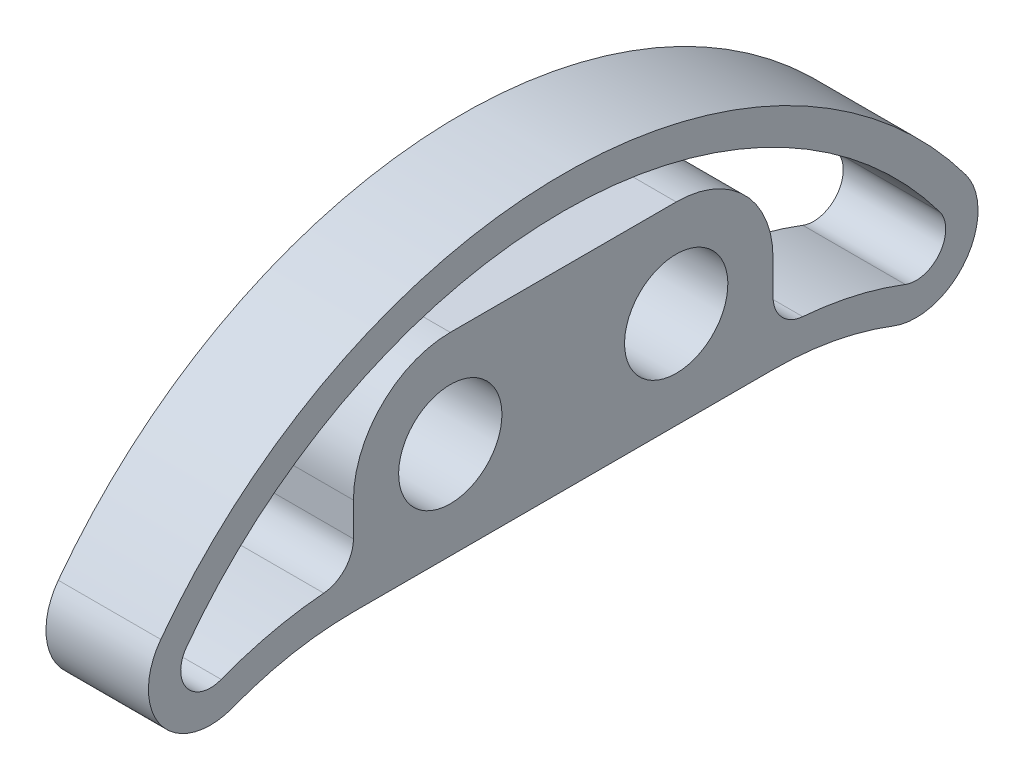
ISO-10303-21;
HEADER;
FILE_DESCRIPTION(('STEP AP214'),'2;1');
FILE_NAME('part.step','',(''),(''),'','','');
FILE_SCHEMA(('AUTOMOTIVE_DESIGN { 1 0 10303 214 1 1 1 1 }'));
ENDSEC;
DATA;
#1=APPLICATION_CONTEXT('core data for automotive mechanical design processes');
#2=APPLICATION_PROTOCOL_DEFINITION('international standard','automotive_design',2000,#1);
#3=PRODUCT_CONTEXT('',#1,'mechanical');
#4=PRODUCT('Part','Part','',(#3));
#5=PRODUCT_RELATED_PRODUCT_CATEGORY('part','',(#4));
#6=PRODUCT_DEFINITION_FORMATION('','',#4);
#7=PRODUCT_DEFINITION_CONTEXT('part definition',#1,'design');
#8=PRODUCT_DEFINITION('design','',#6,#7);
#9=PRODUCT_DEFINITION_SHAPE('','',#8);
#10=(LENGTH_UNIT() NAMED_UNIT(*) SI_UNIT(.MILLI.,.METRE.));
#11=(NAMED_UNIT(*) PLANE_ANGLE_UNIT() SI_UNIT($,.RADIAN.));
#12=(NAMED_UNIT(*) SI_UNIT($,.STERADIAN.) SOLID_ANGLE_UNIT());
#13=UNCERTAINTY_MEASURE_WITH_UNIT(LENGTH_MEASURE(1.E-05),#10,'distance_accuracy_value','');
#14=(GEOMETRIC_REPRESENTATION_CONTEXT(3) GLOBAL_UNCERTAINTY_ASSIGNED_CONTEXT((#13)) GLOBAL_UNIT_ASSIGNED_CONTEXT((#10,
#11,#12)) REPRESENTATION_CONTEXT('',''));
#15=CARTESIAN_POINT('',(0.,0.,0.));
#16=DIRECTION('',(0.,0.,1.));
#17=DIRECTION('',(1.,0.,0.));
#18=AXIS2_PLACEMENT_3D('',#15,#16,#17);
#19=CARTESIAN_POINT('',(27.975,26.9595465994208,25.));
#20=DIRECTION('',(-1.,0.,0.));
#21=DIRECTION('',(0.,-1.,0.));
#22=AXIS2_PLACEMENT_3D('',#19,#20,#21);
#23=CYLINDRICAL_SURFACE('',#22,1.);
#24=DIRECTION('',(1.,0.,0.));
#25=VECTOR('',#24,1.);
#26=CARTESIAN_POINT('',(27.975,26.9595465994208,24.));
#27=LINE('',#26,#25);
#28=CARTESIAN_POINT('',(24.8,26.9595465994208,24.));
#29=VERTEX_POINT('',#28);
#30=CARTESIAN_POINT('',(27.975,26.9595465994208,24.));
#31=VERTEX_POINT('',#30);
#32=EDGE_CURVE('E223',#29,#31,#27,.T.);
#33=ORIENTED_EDGE('',*,*,#32,.F.);
#34=CARTESIAN_POINT('',(24.8,26.9595465994208,25.));
#35=DIRECTION('',(-1.,0.,0.));
#36=DIRECTION('',(0.,-1.,0.));
#37=AXIS2_PLACEMENT_3D('',#34,#35,#36);
#38=CIRCLE('',#37,1.);
#39=CARTESIAN_POINT('',(24.8,25.9628142072905,24.9192253846918));
#40=VERTEX_POINT('',#39);
#41=EDGE_CURVE('E208',#40,#29,#38,.F.);
#42=ORIENTED_EDGE('',*,*,#41,.F.);
#43=DIRECTION('',(-1.,0.,0.));
#44=VECTOR('',#43,1.);
#45=CARTESIAN_POINT('',(27.975,25.9628142072905,24.9192253846918));
#46=LINE('',#45,#44);
#47=CARTESIAN_POINT('',(27.975,25.9628142072905,24.9192253846918));
#48=VERTEX_POINT('',#47);
#49=EDGE_CURVE('E297',#48,#40,#46,.T.);
#50=ORIENTED_EDGE('',*,*,#49,.F.);
#51=CARTESIAN_POINT('',(27.975,26.9595465994208,25.));
#52=DIRECTION('',(-1.,0.,0.));
#53=DIRECTION('',(0.,-1.,0.));
#54=AXIS2_PLACEMENT_3D('',#51,#52,#53);
#55=CIRCLE('',#54,1.);
#56=EDGE_CURVE('E19',#31,#48,#55,.T.);
#57=ORIENTED_EDGE('',*,*,#56,.F.);
#58=EDGE_LOOP('',(#33,#42,#50,#57));
#59=FACE_BOUND('',#58,.T.);
#60=ADVANCED_FACE('F16',(#59),#23,.F.);
#61=CARTESIAN_POINT('',(27.975,26.,24.));
#62=DIRECTION('',(0.,0.,1.));
#63=DIRECTION('',(0.,-1.,0.));
#64=AXIS2_PLACEMENT_3D('',#61,#62,#63);
#65=PLANE('',#64);
#66=DIRECTION('',(0.,-1.,0.));
#67=VECTOR('',#66,1.);
#68=CARTESIAN_POINT('',(27.975,26.,24.));
#69=LINE('',#68,#67);
#70=CARTESIAN_POINT('',(27.975,28.,24.));
#71=VERTEX_POINT('',#70);
#72=EDGE_CURVE('E215',#31,#71,#69,.F.);
#73=ORIENTED_EDGE('',*,*,#72,.T.);
#74=DIRECTION('',(-1.,0.,0.));
#75=VECTOR('',#74,1.);
#76=CARTESIAN_POINT('',(27.975,28.,24.));
#77=LINE('',#76,#75);
#78=CARTESIAN_POINT('',(24.8,28.,24.));
#79=VERTEX_POINT('',#78);
#80=EDGE_CURVE('E220',#79,#71,#77,.F.);
#81=ORIENTED_EDGE('',*,*,#80,.F.);
#82=DIRECTION('',(0.,-1.,0.));
#83=VECTOR('',#82,1.);
#84=CARTESIAN_POINT('',(24.8,14.6198729491416,24.));
#85=LINE('',#84,#83);
#86=EDGE_CURVE('E204',#29,#79,#85,.F.);
#87=ORIENTED_EDGE('',*,*,#86,.F.);
#88=ORIENTED_EDGE('',*,*,#32,.T.);
#89=EDGE_LOOP('',(#73,#81,#87,#88));
#90=FACE_BOUND('',#89,.T.);
#91=ADVANCED_FACE('F347',(#90),#65,.T.);
#92=CARTESIAN_POINT('',(27.975,26.,11.));
#93=DIRECTION('',(0.,0.,-1.));
#94=DIRECTION('',(-1.,0.,0.));
#95=AXIS2_PLACEMENT_3D('',#92,#93,#94);
#96=PLANE('',#95);
#97=DIRECTION('',(0.,-1.,0.));
#98=VECTOR('',#97,1.);
#99=CARTESIAN_POINT('',(24.8,14.6198729491416,11.));
#100=LINE('',#99,#98);
#101=CARTESIAN_POINT('',(24.8,28.,11.));
#102=VERTEX_POINT('',#101);
#103=CARTESIAN_POINT('',(24.8,26.9595465994209,11.));
#104=VERTEX_POINT('',#103);
#105=EDGE_CURVE('E209',#102,#104,#100,.T.);
#106=ORIENTED_EDGE('',*,*,#105,.F.);
#107=DIRECTION('',(-1.,0.,0.));
#108=VECTOR('',#107,1.);
#109=CARTESIAN_POINT('',(27.975,28.,11.));
#110=LINE('',#109,#108);
#111=CARTESIAN_POINT('',(27.975,28.,11.));
#112=VERTEX_POINT('',#111);
#113=EDGE_CURVE('E283',#112,#102,#110,.T.);
#114=ORIENTED_EDGE('',*,*,#113,.F.);
#115=DIRECTION('',(0.,1.,0.));
#116=VECTOR('',#115,1.);
#117=CARTESIAN_POINT('',(27.975,26.,11.));
#118=LINE('',#117,#116);
#119=CARTESIAN_POINT('',(27.975,26.9595465994209,11.));
#120=VERTEX_POINT('',#119);
#121=EDGE_CURVE('E212',#112,#120,#118,.F.);
#122=ORIENTED_EDGE('',*,*,#121,.T.);
#123=DIRECTION('',(-1.,0.,0.));
#124=VECTOR('',#123,1.);
#125=CARTESIAN_POINT('',(27.975,26.9595465994209,11.));
#126=LINE('',#125,#124);
#127=EDGE_CURVE('E207',#120,#104,#126,.T.);
#128=ORIENTED_EDGE('',*,*,#127,.T.);
#129=EDGE_LOOP('',(#106,#114,#122,#128));
#130=FACE_BOUND('',#129,.T.);
#131=ADVANCED_FACE('F451',(#130),#96,.T.);
#132=CARTESIAN_POINT('',(24.8,14.6198729491416,11.));
#133=DIRECTION('',(-1.,0.,0.));
#134=DIRECTION('',(0.,-1.,0.));
#135=AXIS2_PLACEMENT_3D('',#132,#133,#134);
#136=PLANE('',#135);
#137=DIRECTION('',(0.,0.,1.));
#138=VECTOR('',#137,1.);
#139=CARTESIAN_POINT('',(24.8,31.,14.));
#140=LINE('',#139,#138);
#141=CARTESIAN_POINT('',(24.8,31.,14.));
#142=VERTEX_POINT('',#141);
#143=CARTESIAN_POINT('',(24.8,31.,21.));
#144=VERTEX_POINT('',#143);
#145=EDGE_CURVE('E216',#142,#144,#140,.T.);
#146=ORIENTED_EDGE('',*,*,#145,.F.);
#147=CARTESIAN_POINT('',(24.8,28.,14.));
#148=DIRECTION('',(-1.,0.,0.));
#149=DIRECTION('',(0.,-1.,0.));
#150=AXIS2_PLACEMENT_3D('',#147,#148,#149);
#151=CIRCLE('',#150,3.);
#152=EDGE_CURVE('E284',#102,#142,#151,.F.);
#153=ORIENTED_EDGE('',*,*,#152,.F.);
#154=ORIENTED_EDGE('',*,*,#105,.T.);
#155=CARTESIAN_POINT('',(24.8,26.9595465994209,10.));
#156=DIRECTION('',(-1.,0.,0.));
#157=DIRECTION('',(0.,-1.,0.));
#158=AXIS2_PLACEMENT_3D('',#155,#156,#157);
#159=CIRCLE('',#158,1.);
#160=CARTESIAN_POINT('',(24.8,25.9628142072905,10.0807746153082));
#161=VERTEX_POINT('',#160);
#162=EDGE_CURVE('E228',#104,#161,#159,.F.);
#163=ORIENTED_EDGE('',*,*,#162,.T.);
#164=CARTESIAN_POINT('',(24.8,14.6198729491416,11.));
#165=DIRECTION('',(-1.,0.,0.));
#166=DIRECTION('',(0.,-1.,0.));
#167=AXIS2_PLACEMENT_3D('',#164,#165,#166);
#168=CIRCLE('',#167,11.3801270508584);
#169=CARTESIAN_POINT('',(24.8,25.2368989387214,6.90292167145082));
#170=VERTEX_POINT('',#169);
#171=EDGE_CURVE('E279',#170,#161,#168,.F.);
#172=ORIENTED_EDGE('',*,*,#171,.F.);
#173=CARTESIAN_POINT('',(24.8,26.0969650195722,6.57102476317985));
#174=DIRECTION('',(-1.,0.,0.));
#175=DIRECTION('',(0.,-1.,0.));
#176=AXIS2_PLACEMENT_3D('',#173,#174,#175);
#177=CIRCLE('',#176,0.921883518211437);
#178=CARTESIAN_POINT('',(24.8,26.6482953762254,5.83217155787958));
#179=VERTEX_POINT('',#178);
#180=EDGE_CURVE('E306',#170,#179,#177,.F.);
#181=ORIENTED_EDGE('',*,*,#180,.T.);
#182=CARTESIAN_POINT('',(24.8,17.9417918783504,17.5));
#183=DIRECTION('',(-1.,0.,0.));
#184=DIRECTION('',(0.,-1.,0.));
#185=AXIS2_PLACEMENT_3D('',#182,#183,#184);
#186=CIRCLE('',#185,14.5582081216496);
#187=CARTESIAN_POINT('',(24.8,26.6482953762254,29.1678284421204));
#188=VERTEX_POINT('',#187);
#189=EDGE_CURVE('E302',#179,#188,#186,.F.);
#190=ORIENTED_EDGE('',*,*,#189,.T.);
#191=CARTESIAN_POINT('',(24.8,26.0969650195722,28.4289752368201));
#192=DIRECTION('',(-1.,0.,0.));
#193=DIRECTION('',(0.,-1.,0.));
#194=AXIS2_PLACEMENT_3D('',#191,#192,#193);
#195=CIRCLE('',#194,0.921883518211437);
#196=CARTESIAN_POINT('',(24.8,25.2368989387213,28.0970783285492));
#197=VERTEX_POINT('',#196);
#198=EDGE_CURVE('E298',#188,#197,#195,.F.);
#199=ORIENTED_EDGE('',*,*,#198,.T.);
#200=CARTESIAN_POINT('',(24.8,14.6198729491416,24.));
#201=DIRECTION('',(-1.,0.,0.));
#202=DIRECTION('',(0.,-1.,0.));
#203=AXIS2_PLACEMENT_3D('',#200,#201,#202);
#204=CIRCLE('',#203,11.3801270508584);
#205=EDGE_CURVE('E293',#40,#197,#204,.F.);
#206=ORIENTED_EDGE('',*,*,#205,.F.);
#207=ORIENTED_EDGE('',*,*,#41,.T.);
#208=ORIENTED_EDGE('',*,*,#86,.T.);
#209=CARTESIAN_POINT('',(24.8,28.,21.));
#210=DIRECTION('',(-1.,0.,0.));
#211=DIRECTION('',(0.,-1.,0.));
#212=AXIS2_PLACEMENT_3D('',#209,#210,#211);
#213=CIRCLE('',#212,3.);
#214=EDGE_CURVE('E288',#144,#79,#213,.F.);
#215=ORIENTED_EDGE('',*,*,#214,.F.);
#216=EDGE_LOOP('',(#146,#153,#154,#163,#172,#181,#190,#199,#206,#207,#208,#215));
#217=FACE_BOUND('',#216,.T.);
#218=CARTESIAN_POINT('',(24.8,28.,14.));
#219=DIRECTION('',(-1.,0.,0.));
#220=DIRECTION('',(0.,-1.,0.));
#221=AXIS2_PLACEMENT_3D('',#218,#219,#220);
#222=CIRCLE('',#221,1.6);
#223=CARTESIAN_POINT('',(24.8,26.4,14.));
#224=VERTEX_POINT('',#223);
#225=EDGE_CURVE('E323',#224,#224,#222,.F.);
#226=ORIENTED_EDGE('',*,*,#225,.T.);
#227=EDGE_LOOP('',(#226));
#228=FACE_BOUND('',#227,.T.);
#229=CARTESIAN_POINT('',(24.8,26.0969650195722,6.57102476317985));
#230=DIRECTION('',(-1.,0.,0.));
#231=DIRECTION('',(0.,-1.,0.));
#232=AXIS2_PLACEMENT_3D('',#229,#230,#231);
#233=CIRCLE('',#232,1.92188351821144);
#234=CARTESIAN_POINT('',(24.8,24.3039545223601,7.26294210973232));
#235=VERTEX_POINT('',#234);
#236=CARTESIAN_POINT('',(24.8,27.2463431184422,5.03071107973397));
#237=VERTEX_POINT('',#236);
#238=EDGE_CURVE('E312',#235,#237,#233,.F.);
#239=ORIENTED_EDGE('',*,*,#238,.F.);
#240=CARTESIAN_POINT('',(24.8,14.6198729491416,11.));
#241=DIRECTION('',(-1.,0.,0.));
#242=DIRECTION('',(0.,-1.,0.));
#243=AXIS2_PLACEMENT_3D('',#240,#241,#242);
#244=CIRCLE('',#243,10.3801270508584);
#245=CARTESIAN_POINT('',(24.8,25.,11.));
#246=VERTEX_POINT('',#245);
#247=EDGE_CURVE('E174',#235,#246,#244,.F.);
#248=ORIENTED_EDGE('',*,*,#247,.T.);
#249=DIRECTION('',(0.,0.,1.));
#250=VECTOR('',#249,1.);
#251=CARTESIAN_POINT('',(24.8,25.,24.));
#252=LINE('',#251,#250);
#253=CARTESIAN_POINT('',(24.8,25.,24.));
#254=VERTEX_POINT('',#253);
#255=EDGE_CURVE('E168',#246,#254,#252,.T.);
#256=ORIENTED_EDGE('',*,*,#255,.T.);
#257=CARTESIAN_POINT('',(24.8,14.6198729491416,24.));
#258=DIRECTION('',(-1.,0.,0.));
#259=DIRECTION('',(0.,-1.,0.));
#260=AXIS2_PLACEMENT_3D('',#257,#258,#259);
#261=CIRCLE('',#260,10.3801270508584);
#262=CARTESIAN_POINT('',(24.8,24.3039545223601,27.7370578902677));
#263=VERTEX_POINT('',#262);
#264=EDGE_CURVE('E172',#254,#263,#261,.F.);
#265=ORIENTED_EDGE('',*,*,#264,.T.);
#266=CARTESIAN_POINT('',(24.8,26.0969650195722,28.4289752368201));
#267=DIRECTION('',(-1.,0.,0.));
#268=DIRECTION('',(0.,-1.,0.));
#269=AXIS2_PLACEMENT_3D('',#266,#267,#268);
#270=CIRCLE('',#269,1.92188351821144);
#271=CARTESIAN_POINT('',(24.8,27.2463431184422,29.969288920266));
#272=VERTEX_POINT('',#271);
#273=EDGE_CURVE('E191',#272,#263,#270,.F.);
#274=ORIENTED_EDGE('',*,*,#273,.F.);
#275=CARTESIAN_POINT('',(24.8,17.9417918783504,17.5));
#276=DIRECTION('',(-1.,0.,0.));
#277=DIRECTION('',(0.,-1.,0.));
#278=AXIS2_PLACEMENT_3D('',#275,#276,#277);
#279=CIRCLE('',#278,15.5582081216496);
#280=EDGE_CURVE('E161',#237,#272,#279,.F.);
#281=ORIENTED_EDGE('',*,*,#280,.F.);
#282=EDGE_LOOP('',(#239,#248,#256,#265,#274,#281));
#283=FACE_BOUND('',#282,.T.);
#284=CARTESIAN_POINT('',(24.8,28.,21.));
#285=DIRECTION('',(-1.,0.,0.));
#286=DIRECTION('',(0.,-1.,0.));
#287=AXIS2_PLACEMENT_3D('',#284,#285,#286);
#288=CIRCLE('',#287,1.6);
#289=CARTESIAN_POINT('',(24.8,26.4,21.));
#290=VERTEX_POINT('',#289);
#291=EDGE_CURVE('E181',#290,#290,#288,.F.);
#292=ORIENTED_EDGE('',*,*,#291,.T.);
#293=EDGE_LOOP('',(#292));
#294=FACE_BOUND('',#293,.T.);
#295=ADVANCED_FACE('F170',(#217,#228,#283,#294),#136,.T.);
#296=CARTESIAN_POINT('',(27.975,26.9595465994209,10.));
#297=DIRECTION('',(-1.,0.,0.));
#298=DIRECTION('',(0.,-1.,0.));
#299=AXIS2_PLACEMENT_3D('',#296,#297,#298);
#300=CYLINDRICAL_SURFACE('',#299,1.);
#301=DIRECTION('',(-1.,0.,0.));
#302=VECTOR('',#301,1.);
#303=CARTESIAN_POINT('',(27.975,25.9628142072905,10.0807746153082));
#304=LINE('',#303,#302);
#305=CARTESIAN_POINT('',(27.975,25.9628142072905,10.0807746153082));
#306=VERTEX_POINT('',#305);
#307=EDGE_CURVE('E282',#161,#306,#304,.F.);
#308=ORIENTED_EDGE('',*,*,#307,.F.);
#309=ORIENTED_EDGE('',*,*,#162,.F.);
#310=ORIENTED_EDGE('',*,*,#127,.F.);
#311=CARTESIAN_POINT('',(27.975,26.9595465994209,10.));
#312=DIRECTION('',(-1.,0.,0.));
#313=DIRECTION('',(0.,-1.,0.));
#314=AXIS2_PLACEMENT_3D('',#311,#312,#313);
#315=CIRCLE('',#314,1.);
#316=EDGE_CURVE('E327',#306,#120,#315,.T.);
#317=ORIENTED_EDGE('',*,*,#316,.F.);
#318=EDGE_LOOP('',(#308,#309,#310,#317));
#319=FACE_BOUND('',#318,.T.);
#320=ADVANCED_FACE('F448',(#319),#300,.F.);
#321=CARTESIAN_POINT('',(27.975,28.,14.));
#322=DIRECTION('',(-1.,0.,0.));
#323=DIRECTION('',(0.,-1.,0.));
#324=AXIS2_PLACEMENT_3D('',#321,#322,#323);
#325=CYLINDRICAL_SURFACE('',#324,1.6);
#326=ORIENTED_EDGE('',*,*,#225,.F.);
#327=EDGE_LOOP('',(#326));
#328=FACE_BOUND('',#327,.T.);
#329=CARTESIAN_POINT('',(27.975,28.,14.));
#330=DIRECTION('',(-1.,0.,0.));
#331=DIRECTION('',(0.,-1.,0.));
#332=AXIS2_PLACEMENT_3D('',#329,#330,#331);
#333=CIRCLE('',#332,1.6);
#334=CARTESIAN_POINT('',(27.975,26.4,14.));
#335=VERTEX_POINT('',#334);
#336=EDGE_CURVE('E274',#335,#335,#333,.F.);
#337=ORIENTED_EDGE('',*,*,#336,.T.);
#338=EDGE_LOOP('',(#337));
#339=FACE_BOUND('',#338,.T.);
#340=ADVANCED_FACE('F501',(#328,#339),#325,.F.);
#341=CARTESIAN_POINT('',(27.975,28.,21.));
#342=DIRECTION('',(-1.,0.,0.));
#343=DIRECTION('',(0.,-1.,0.));
#344=AXIS2_PLACEMENT_3D('',#341,#342,#343);
#345=CYLINDRICAL_SURFACE('',#344,1.6);
#346=ORIENTED_EDGE('',*,*,#291,.F.);
#347=EDGE_LOOP('',(#346));
#348=FACE_BOUND('',#347,.T.);
#349=CARTESIAN_POINT('',(27.975,28.,21.));
#350=DIRECTION('',(-1.,0.,0.));
#351=DIRECTION('',(0.,-1.,0.));
#352=AXIS2_PLACEMENT_3D('',#349,#350,#351);
#353=CIRCLE('',#352,1.6);
#354=CARTESIAN_POINT('',(27.975,26.4,21.));
#355=VERTEX_POINT('',#354);
#356=EDGE_CURVE('E270',#355,#355,#353,.F.);
#357=ORIENTED_EDGE('',*,*,#356,.T.);
#358=EDGE_LOOP('',(#357));
#359=FACE_BOUND('',#358,.T.);
#360=ADVANCED_FACE('F504',(#348,#359),#345,.F.);
#361=CARTESIAN_POINT('',(27.975,25.,24.));
#362=DIRECTION('',(0.,1.,0.));
#363=DIRECTION('',(-1.,0.,0.));
#364=AXIS2_PLACEMENT_3D('',#361,#362,#363);
#365=PLANE('',#364);
#366=DIRECTION('',(-1.,0.,0.));
#367=VECTOR('',#366,1.);
#368=CARTESIAN_POINT('',(27.975,25.,11.));
#369=LINE('',#368,#367);
#370=CARTESIAN_POINT('',(27.975,25.,11.));
#371=VERTEX_POINT('',#370);
#372=EDGE_CURVE('E367',#246,#371,#369,.F.);
#373=ORIENTED_EDGE('',*,*,#372,.T.);
#374=DIRECTION('',(0.,0.,1.));
#375=VECTOR('',#374,1.);
#376=CARTESIAN_POINT('',(27.975,25.,11.));
#377=LINE('',#376,#375);
#378=CARTESIAN_POINT('',(27.975,25.,24.));
#379=VERTEX_POINT('',#378);
#380=EDGE_CURVE('E196',#371,#379,#377,.T.);
#381=ORIENTED_EDGE('',*,*,#380,.T.);
#382=DIRECTION('',(-1.,0.,0.));
#383=VECTOR('',#382,1.);
#384=CARTESIAN_POINT('',(27.975,25.,24.));
#385=LINE('',#384,#383);
#386=EDGE_CURVE('E187',#379,#254,#385,.T.);
#387=ORIENTED_EDGE('',*,*,#386,.T.);
#388=ORIENTED_EDGE('',*,*,#255,.F.);
#389=EDGE_LOOP('',(#373,#381,#387,#388));
#390=FACE_BOUND('',#389,.T.);
#391=ADVANCED_FACE('F194',(#390),#365,.F.);
#392=CARTESIAN_POINT('',(27.975,14.6198729491416,24.));
#393=DIRECTION('',(-1.,0.,0.));
#394=DIRECTION('',(0.,-1.,0.));
#395=AXIS2_PLACEMENT_3D('',#392,#393,#394);
#396=CYLINDRICAL_SURFACE('',#395,10.3801270508584);
#397=ORIENTED_EDGE('',*,*,#386,.F.);
#398=CARTESIAN_POINT('',(27.975,14.6198729491416,24.));
#399=DIRECTION('',(-1.,0.,0.));
#400=DIRECTION('',(0.,-1.,0.));
#401=AXIS2_PLACEMENT_3D('',#398,#399,#400);
#402=CIRCLE('',#401,10.3801270508584);
#403=CARTESIAN_POINT('',(27.975,24.3039545223601,27.7370578902677));
#404=VERTEX_POINT('',#403);
#405=EDGE_CURVE('E267',#379,#404,#402,.F.);
#406=ORIENTED_EDGE('',*,*,#405,.T.);
#407=DIRECTION('',(-1.,0.,0.));
#408=VECTOR('',#407,1.);
#409=CARTESIAN_POINT('',(27.975,24.3039545223601,27.7370578902677));
#410=LINE('',#409,#408);
#411=EDGE_CURVE('E180',#263,#404,#410,.F.);
#412=ORIENTED_EDGE('',*,*,#411,.F.);
#413=ORIENTED_EDGE('',*,*,#264,.F.);
#414=EDGE_LOOP('',(#397,#406,#412,#413));
#415=FACE_BOUND('',#414,.T.);
#416=ADVANCED_FACE('F185',(#415),#396,.F.);
#417=CARTESIAN_POINT('',(27.975,26.0969650195722,28.4289752368201));
#418=DIRECTION('',(-1.,0.,0.));
#419=DIRECTION('',(0.,-1.,0.));
#420=AXIS2_PLACEMENT_3D('',#417,#418,#419);
#421=CYLINDRICAL_SURFACE('',#420,1.92188351821144);
#422=DIRECTION('',(-1.,0.,0.));
#423=VECTOR('',#422,1.);
#424=CARTESIAN_POINT('',(27.975,27.2463431184422,29.969288920266));
#425=LINE('',#424,#423);
#426=CARTESIAN_POINT('',(27.975,27.2463431184422,29.969288920266));
#427=VERTEX_POINT('',#426);
#428=EDGE_CURVE('E315',#272,#427,#425,.F.);
#429=ORIENTED_EDGE('',*,*,#428,.F.);
#430=ORIENTED_EDGE('',*,*,#273,.T.);
#431=ORIENTED_EDGE('',*,*,#411,.T.);
#432=CARTESIAN_POINT('',(27.975,26.0969650195722,28.4289752368201));
#433=DIRECTION('',(-1.,0.,0.));
#434=DIRECTION('',(0.,-1.,0.));
#435=AXIS2_PLACEMENT_3D('',#432,#433,#434);
#436=CIRCLE('',#435,1.92188351821144);
#437=EDGE_CURVE('E263',#404,#427,#436,.T.);
#438=ORIENTED_EDGE('',*,*,#437,.T.);
#439=EDGE_LOOP('',(#429,#430,#431,#438));
#440=FACE_BOUND('',#439,.T.);
#441=ADVANCED_FACE('F383',(#440),#421,.T.);
#442=CARTESIAN_POINT('',(27.975,17.9417918783504,17.5));
#443=DIRECTION('',(-1.,0.,0.));
#444=DIRECTION('',(0.,-1.,0.));
#445=AXIS2_PLACEMENT_3D('',#442,#443,#444);
#446=CYLINDRICAL_SURFACE('',#445,15.5582081216496);
#447=CARTESIAN_POINT('',(27.975,17.9417918783504,17.5));
#448=DIRECTION('',(-1.,0.,0.));
#449=DIRECTION('',(0.,-1.,0.));
#450=AXIS2_PLACEMENT_3D('',#447,#448,#449);
#451=CIRCLE('',#450,15.5582081216496);
#452=CARTESIAN_POINT('',(27.975,27.2463431184422,5.03071107973397));
#453=VERTEX_POINT('',#452);
#454=EDGE_CURVE('E259',#427,#453,#451,.T.);
#455=ORIENTED_EDGE('',*,*,#454,.T.);
#456=DIRECTION('',(-1.,0.,0.));
#457=VECTOR('',#456,1.);
#458=CARTESIAN_POINT('',(27.975,27.2463431184422,5.03071107973397));
#459=LINE('',#458,#457);
#460=EDGE_CURVE('E122',#237,#453,#459,.F.);
#461=ORIENTED_EDGE('',*,*,#460,.F.);
#462=ORIENTED_EDGE('',*,*,#280,.T.);
#463=ORIENTED_EDGE('',*,*,#428,.T.);
#464=EDGE_LOOP('',(#455,#461,#462,#463));
#465=FACE_BOUND('',#464,.T.);
#466=ADVANCED_FACE('F376',(#465),#446,.T.);
#467=CARTESIAN_POINT('',(27.975,26.0969650195722,6.57102476317985));
#468=DIRECTION('',(-1.,0.,0.));
#469=DIRECTION('',(0.,-1.,0.));
#470=AXIS2_PLACEMENT_3D('',#467,#468,#469);
#471=CYLINDRICAL_SURFACE('',#470,1.92188351821144);
#472=ORIENTED_EDGE('',*,*,#238,.T.);
#473=ORIENTED_EDGE('',*,*,#460,.T.);
#474=CARTESIAN_POINT('',(27.975,26.0969650195722,6.57102476317985));
#475=DIRECTION('',(-1.,0.,0.));
#476=DIRECTION('',(0.,-1.,0.));
#477=AXIS2_PLACEMENT_3D('',#474,#475,#476);
#478=CIRCLE('',#477,1.92188351821144);
#479=CARTESIAN_POINT('',(27.975,24.3039545223601,7.26294210973232));
#480=VERTEX_POINT('',#479);
#481=EDGE_CURVE('E111',#453,#480,#478,.T.);
#482=ORIENTED_EDGE('',*,*,#481,.T.);
#483=DIRECTION('',(-1.,0.,0.));
#484=VECTOR('',#483,1.);
#485=CARTESIAN_POINT('',(27.975,24.3039545223601,7.26294210973232));
#486=LINE('',#485,#484);
#487=EDGE_CURVE('E311',#480,#235,#486,.T.);
#488=ORIENTED_EDGE('',*,*,#487,.T.);
#489=EDGE_LOOP('',(#472,#473,#482,#488));
#490=FACE_BOUND('',#489,.T.);
#491=ADVANCED_FACE('F390',(#490),#471,.T.);
#492=CARTESIAN_POINT('',(27.975,14.6198729491416,11.));
#493=DIRECTION('',(-1.,0.,0.));
#494=DIRECTION('',(0.,-1.,0.));
#495=AXIS2_PLACEMENT_3D('',#492,#493,#494);
#496=CYLINDRICAL_SURFACE('',#495,10.3801270508584);
#497=ORIENTED_EDGE('',*,*,#487,.F.);
#498=CARTESIAN_POINT('',(27.975,14.6198729491416,11.));
#499=DIRECTION('',(-1.,0.,0.));
#500=DIRECTION('',(0.,-1.,0.));
#501=AXIS2_PLACEMENT_3D('',#498,#499,#500);
#502=CIRCLE('',#501,10.3801270508584);
#503=EDGE_CURVE('E253',#480,#371,#502,.F.);
#504=ORIENTED_EDGE('',*,*,#503,.T.);
#505=ORIENTED_EDGE('',*,*,#372,.F.);
#506=ORIENTED_EDGE('',*,*,#247,.F.);
#507=EDGE_LOOP('',(#497,#504,#505,#506));
#508=FACE_BOUND('',#507,.T.);
#509=ADVANCED_FACE('F389',(#508),#496,.F.);
#510=CARTESIAN_POINT('',(27.975,26.0969650195722,6.57102476317985));
#511=DIRECTION('',(-1.,0.,0.));
#512=DIRECTION('',(0.,-1.,0.));
#513=AXIS2_PLACEMENT_3D('',#510,#511,#512);
#514=CYLINDRICAL_SURFACE('',#513,0.921883518211437);
#515=CARTESIAN_POINT('',(27.975,26.0969650195722,6.57102476317985));
#516=DIRECTION('',(-1.,0.,0.));
#517=DIRECTION('',(0.,-1.,0.));
#518=AXIS2_PLACEMENT_3D('',#515,#516,#517);
#519=CIRCLE('',#518,0.921883518211437);
#520=CARTESIAN_POINT('',(27.975,25.2368989387214,6.90292167145082));
#521=VERTEX_POINT('',#520);
#522=CARTESIAN_POINT('',(27.975,26.6482953762254,5.83217155787959));
#523=VERTEX_POINT('',#522);
#524=EDGE_CURVE('E39',#521,#523,#519,.F.);
#525=ORIENTED_EDGE('',*,*,#524,.T.);
#526=DIRECTION('',(-1.,0.,0.));
#527=VECTOR('',#526,1.);
#528=CARTESIAN_POINT('',(27.975,26.6482953762254,5.8321715578796));
#529=LINE('',#528,#527);
#530=EDGE_CURVE('E305',#523,#179,#529,.T.);
#531=ORIENTED_EDGE('',*,*,#530,.T.);
#532=ORIENTED_EDGE('',*,*,#180,.F.);
#533=DIRECTION('',(-1.,0.,0.));
#534=VECTOR('',#533,1.);
#535=CARTESIAN_POINT('',(27.975,25.2368989387214,6.90292167145082));
#536=LINE('',#535,#534);
#537=EDGE_CURVE('E278',#521,#170,#536,.T.);
#538=ORIENTED_EDGE('',*,*,#537,.F.);
#539=EDGE_LOOP('',(#525,#531,#532,#538));
#540=FACE_BOUND('',#539,.T.);
#541=ADVANCED_FACE('F398',(#540),#514,.F.);
#542=CARTESIAN_POINT('',(27.975,17.9417918783504,17.5));
#543=DIRECTION('',(-1.,0.,0.));
#544=DIRECTION('',(0.,-1.,0.));
#545=AXIS2_PLACEMENT_3D('',#542,#543,#544);
#546=CYLINDRICAL_SURFACE('',#545,14.5582081216496);
#547=ORIENTED_EDGE('',*,*,#530,.F.);
#548=CARTESIAN_POINT('',(27.975,17.9417918783504,17.5));
#549=DIRECTION('',(-1.,0.,0.));
#550=DIRECTION('',(0.,-1.,0.));
#551=AXIS2_PLACEMENT_3D('',#548,#549,#550);
#552=CIRCLE('',#551,14.5582081216496);
#553=CARTESIAN_POINT('',(27.975,26.6482953762254,29.1678284421204));
#554=VERTEX_POINT('',#553);
#555=EDGE_CURVE('E247',#523,#554,#552,.F.);
#556=ORIENTED_EDGE('',*,*,#555,.T.);
#557=DIRECTION('',(-1.,0.,0.));
#558=VECTOR('',#557,1.);
#559=CARTESIAN_POINT('',(27.975,26.6482953762254,29.1678284421204));
#560=LINE('',#559,#558);
#561=EDGE_CURVE('E301',#554,#188,#560,.T.);
#562=ORIENTED_EDGE('',*,*,#561,.T.);
#563=ORIENTED_EDGE('',*,*,#189,.F.);
#564=EDGE_LOOP('',(#547,#556,#562,#563));
#565=FACE_BOUND('',#564,.T.);
#566=ADVANCED_FACE('F428',(#565),#546,.F.);
#567=CARTESIAN_POINT('',(27.975,26.0969650195722,28.4289752368201));
#568=DIRECTION('',(-1.,0.,0.));
#569=DIRECTION('',(0.,-1.,0.));
#570=AXIS2_PLACEMENT_3D('',#567,#568,#569);
#571=CYLINDRICAL_SURFACE('',#570,0.921883518211437);
#572=CARTESIAN_POINT('',(27.975,26.0969650195722,28.4289752368201));
#573=DIRECTION('',(-1.,0.,0.));
#574=DIRECTION('',(0.,-1.,0.));
#575=AXIS2_PLACEMENT_3D('',#572,#573,#574);
#576=CIRCLE('',#575,0.921883518211437);
#577=CARTESIAN_POINT('',(27.975,25.2368989387213,28.0970783285492));
#578=VERTEX_POINT('',#577);
#579=EDGE_CURVE('E244',#554,#578,#576,.F.);
#580=ORIENTED_EDGE('',*,*,#579,.T.);
#581=DIRECTION('',(-1.,0.,0.));
#582=VECTOR('',#581,1.);
#583=CARTESIAN_POINT('',(27.975,25.2368989387213,28.0970783285492));
#584=LINE('',#583,#582);
#585=EDGE_CURVE('E292',#197,#578,#584,.F.);
#586=ORIENTED_EDGE('',*,*,#585,.F.);
#587=ORIENTED_EDGE('',*,*,#198,.F.);
#588=ORIENTED_EDGE('',*,*,#561,.F.);
#589=EDGE_LOOP('',(#580,#586,#587,#588));
#590=FACE_BOUND('',#589,.T.);
#591=ADVANCED_FACE('F424',(#590),#571,.F.);
#592=CARTESIAN_POINT('',(27.975,14.6198729491416,24.));
#593=DIRECTION('',(-1.,0.,0.));
#594=DIRECTION('',(0.,-1.,0.));
#595=AXIS2_PLACEMENT_3D('',#592,#593,#594);
#596=CYLINDRICAL_SURFACE('',#595,11.3801270508584);
#597=ORIENTED_EDGE('',*,*,#205,.T.);
#598=ORIENTED_EDGE('',*,*,#585,.T.);
#599=CARTESIAN_POINT('',(27.975,14.6198729491416,24.));
#600=DIRECTION('',(-1.,0.,0.));
#601=DIRECTION('',(0.,-1.,0.));
#602=AXIS2_PLACEMENT_3D('',#599,#600,#601);
#603=CIRCLE('',#602,11.3801270508584);
#604=EDGE_CURVE('E240',#578,#48,#603,.T.);
#605=ORIENTED_EDGE('',*,*,#604,.T.);
#606=ORIENTED_EDGE('',*,*,#49,.T.);
#607=EDGE_LOOP('',(#597,#598,#605,#606));
#608=FACE_BOUND('',#607,.T.);
#609=ADVANCED_FACE('F421',(#608),#596,.T.);
#610=CARTESIAN_POINT('',(27.975,28.,21.));
#611=DIRECTION('',(-1.,0.,0.));
#612=DIRECTION('',(0.,-1.,0.));
#613=AXIS2_PLACEMENT_3D('',#610,#611,#612);
#614=CYLINDRICAL_SURFACE('',#613,3.);
#615=CARTESIAN_POINT('',(27.975,28.,21.));
#616=DIRECTION('',(-1.,0.,0.));
#617=DIRECTION('',(0.,-1.,0.));
#618=AXIS2_PLACEMENT_3D('',#615,#616,#617);
#619=CIRCLE('',#618,3.);
#620=CARTESIAN_POINT('',(27.975,31.,21.));
#621=VERTEX_POINT('',#620);
#622=EDGE_CURVE('E236',#71,#621,#619,.T.);
#623=ORIENTED_EDGE('',*,*,#622,.T.);
#624=DIRECTION('',(-1.,0.,0.));
#625=VECTOR('',#624,1.);
#626=CARTESIAN_POINT('',(27.975,31.,21.));
#627=LINE('',#626,#625);
#628=EDGE_CURVE('E219',#144,#621,#627,.F.);
#629=ORIENTED_EDGE('',*,*,#628,.F.);
#630=ORIENTED_EDGE('',*,*,#214,.T.);
#631=ORIENTED_EDGE('',*,*,#80,.T.);
#632=EDGE_LOOP('',(#623,#629,#630,#631));
#633=FACE_BOUND('',#632,.T.);
#634=ADVANCED_FACE('F417',(#633),#614,.T.);
#635=CARTESIAN_POINT('',(27.975,31.,14.));
#636=DIRECTION('',(0.,1.,0.));
#637=DIRECTION('',(-1.,0.,0.));
#638=AXIS2_PLACEMENT_3D('',#635,#636,#637);
#639=PLANE('',#638);
#640=DIRECTION('',(0.,0.,1.));
#641=VECTOR('',#640,1.);
#642=CARTESIAN_POINT('',(27.975,31.,11.));
#643=LINE('',#642,#641);
#644=CARTESIAN_POINT('',(27.975,31.,14.));
#645=VERTEX_POINT('',#644);
#646=EDGE_CURVE('E235',#621,#645,#643,.F.);
#647=ORIENTED_EDGE('',*,*,#646,.T.);
#648=DIRECTION('',(-1.,0.,0.));
#649=VECTOR('',#648,1.);
#650=CARTESIAN_POINT('',(27.975,31.,14.));
#651=LINE('',#650,#649);
#652=EDGE_CURVE('E287',#142,#645,#651,.F.);
#653=ORIENTED_EDGE('',*,*,#652,.F.);
#654=ORIENTED_EDGE('',*,*,#145,.T.);
#655=ORIENTED_EDGE('',*,*,#628,.T.);
#656=EDGE_LOOP('',(#647,#653,#654,#655));
#657=FACE_BOUND('',#656,.T.);
#658=ADVANCED_FACE('F413',(#657),#639,.T.);
#659=CARTESIAN_POINT('',(27.975,28.,14.));
#660=DIRECTION('',(-1.,0.,0.));
#661=DIRECTION('',(0.,-1.,0.));
#662=AXIS2_PLACEMENT_3D('',#659,#660,#661);
#663=CYLINDRICAL_SURFACE('',#662,3.);
#664=CARTESIAN_POINT('',(27.975,28.,14.));
#665=DIRECTION('',(-1.,0.,0.));
#666=DIRECTION('',(0.,-1.,0.));
#667=AXIS2_PLACEMENT_3D('',#664,#665,#666);
#668=CIRCLE('',#667,3.);
#669=EDGE_CURVE('E26',#645,#112,#668,.T.);
#670=ORIENTED_EDGE('',*,*,#669,.T.);
#671=ORIENTED_EDGE('',*,*,#113,.T.);
#672=ORIENTED_EDGE('',*,*,#152,.T.);
#673=ORIENTED_EDGE('',*,*,#652,.T.);
#674=EDGE_LOOP('',(#670,#671,#672,#673));
#675=FACE_BOUND('',#674,.T.);
#676=ADVANCED_FACE('F407',(#675),#663,.T.);
#677=CARTESIAN_POINT('',(27.975,14.6198729491416,11.));
#678=DIRECTION('',(-1.,0.,0.));
#679=DIRECTION('',(0.,-1.,0.));
#680=AXIS2_PLACEMENT_3D('',#677,#678,#679);
#681=CYLINDRICAL_SURFACE('',#680,11.3801270508584);
#682=CARTESIAN_POINT('',(27.975,14.6198729491416,11.));
#683=DIRECTION('',(-1.,0.,0.));
#684=DIRECTION('',(0.,-1.,0.));
#685=AXIS2_PLACEMENT_3D('',#682,#683,#684);
#686=CIRCLE('',#685,11.3801270508584);
#687=EDGE_CURVE('E11',#306,#521,#686,.T.);
#688=ORIENTED_EDGE('',*,*,#687,.T.);
#689=ORIENTED_EDGE('',*,*,#537,.T.);
#690=ORIENTED_EDGE('',*,*,#171,.T.);
#691=ORIENTED_EDGE('',*,*,#307,.T.);
#692=EDGE_LOOP('',(#688,#689,#690,#691));
#693=FACE_BOUND('',#692,.T.);
#694=ADVANCED_FACE('F402',(#693),#681,.T.);
#695=CARTESIAN_POINT('',(27.975,14.6198729491416,11.));
#696=DIRECTION('',(-1.,0.,0.));
#697=DIRECTION('',(0.,-1.,0.));
#698=AXIS2_PLACEMENT_3D('',#695,#696,#697);
#699=PLANE('',#698);
#700=ORIENTED_EDGE('',*,*,#687,.F.);
#701=ORIENTED_EDGE('',*,*,#316,.T.);
#702=ORIENTED_EDGE('',*,*,#121,.F.);
#703=ORIENTED_EDGE('',*,*,#669,.F.);
#704=ORIENTED_EDGE('',*,*,#646,.F.);
#705=ORIENTED_EDGE('',*,*,#622,.F.);
#706=ORIENTED_EDGE('',*,*,#72,.F.);
#707=ORIENTED_EDGE('',*,*,#56,.T.);
#708=ORIENTED_EDGE('',*,*,#604,.F.);
#709=ORIENTED_EDGE('',*,*,#579,.F.);
#710=ORIENTED_EDGE('',*,*,#555,.F.);
#711=ORIENTED_EDGE('',*,*,#524,.F.);
#712=EDGE_LOOP('',(#700,#701,#702,#703,#704,#705,#706,#707,#708,#709,#710,#711));
#713=FACE_BOUND('',#712,.T.);
#714=ORIENTED_EDGE('',*,*,#503,.F.);
#715=ORIENTED_EDGE('',*,*,#481,.F.);
#716=ORIENTED_EDGE('',*,*,#454,.F.);
#717=ORIENTED_EDGE('',*,*,#437,.F.);
#718=ORIENTED_EDGE('',*,*,#405,.F.);
#719=ORIENTED_EDGE('',*,*,#380,.F.);
#720=EDGE_LOOP('',(#714,#715,#716,#717,#718,#719));
#721=FACE_BOUND('',#720,.T.);
#722=ORIENTED_EDGE('',*,*,#356,.F.);
#723=EDGE_LOOP('',(#722));
#724=FACE_BOUND('',#723,.T.);
#725=ORIENTED_EDGE('',*,*,#336,.F.);
#726=EDGE_LOOP('',(#725));
#727=FACE_BOUND('',#726,.T.);
#728=ADVANCED_FACE('F381',(#713,#721,#724,#727),#699,.F.);
#729=CLOSED_SHELL('',(#60,#91,#131,#295,#320,#340,#360,#391,#416,#441,#466,#491,#509,#541,#566,
#591,#609,#634,#658,#676,#694,#728));
#730=MANIFOLD_SOLID_BREP('B1',#729);
#731=ADVANCED_BREP_SHAPE_REPRESENTATION('',(#18,#730),#14);
#732=SHAPE_DEFINITION_REPRESENTATION(#9,#731);
ENDSEC;
END-ISO-10303-21;
